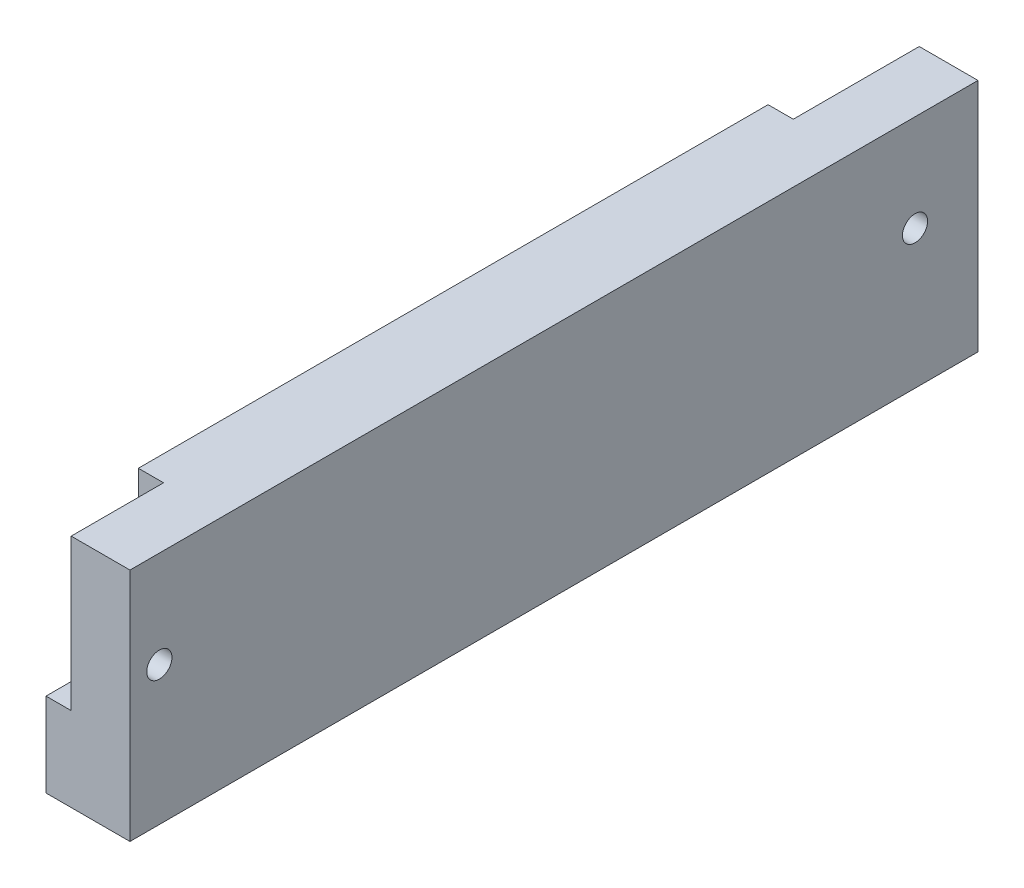
ISO-10303-21;
HEADER;
FILE_DESCRIPTION(('STEP AP214'),'2;1');
FILE_NAME('part.step','',(''),(''),'','','');
FILE_SCHEMA(('AUTOMOTIVE_DESIGN { 1 0 10303 214 1 1 1 1 }'));
ENDSEC;
DATA;
#1=APPLICATION_CONTEXT('core data for automotive mechanical design processes');
#2=APPLICATION_PROTOCOL_DEFINITION('international standard','automotive_design',2000,#1);
#3=PRODUCT_CONTEXT('',#1,'mechanical');
#4=PRODUCT('Part','Part','',(#3));
#5=PRODUCT_RELATED_PRODUCT_CATEGORY('part','',(#4));
#6=PRODUCT_DEFINITION_FORMATION('','',#4);
#7=PRODUCT_DEFINITION_CONTEXT('part definition',#1,'design');
#8=PRODUCT_DEFINITION('design','',#6,#7);
#9=PRODUCT_DEFINITION_SHAPE('','',#8);
#10=(LENGTH_UNIT() NAMED_UNIT(*) SI_UNIT(.MILLI.,.METRE.));
#11=(NAMED_UNIT(*) PLANE_ANGLE_UNIT() SI_UNIT($,.RADIAN.));
#12=(NAMED_UNIT(*) SI_UNIT($,.STERADIAN.) SOLID_ANGLE_UNIT());
#13=UNCERTAINTY_MEASURE_WITH_UNIT(LENGTH_MEASURE(1.E-05),#10,'distance_accuracy_value','');
#14=(GEOMETRIC_REPRESENTATION_CONTEXT(3) GLOBAL_UNCERTAINTY_ASSIGNED_CONTEXT((#13)) GLOBAL_UNIT_ASSIGNED_CONTEXT((#10,
#11,#12)) REPRESENTATION_CONTEXT('',''));
#15=CARTESIAN_POINT('',(0.,0.,0.));
#16=DIRECTION('',(0.,0.,1.));
#17=DIRECTION('',(1.,0.,0.));
#18=AXIS2_PLACEMENT_3D('',#15,#16,#17);
#19=CARTESIAN_POINT('',(5.,14.,105.));
#20=DIRECTION('',(-1.,0.,0.));
#21=DIRECTION('',(0.,0.,1.));
#22=AXIS2_PLACEMENT_3D('',#19,#20,#21);
#23=PLANE('',#22);
#24=CARTESIAN_POINT('',(5.,2.49999999999999,97.5));
#25=DIRECTION('',(-1.,0.,0.));
#26=DIRECTION('',(0.,-1.,0.));
#27=AXIS2_PLACEMENT_3D('',#24,#25,#26);
#28=CIRCLE('',#27,1.5);
#29=CARTESIAN_POINT('',(5.,0.999999999999996,97.5));
#30=VERTEX_POINT('',#29);
#31=EDGE_CURVE('E146',#30,#30,#28,.T.);
#32=ORIENTED_EDGE('',*,*,#31,.T.);
#33=EDGE_LOOP('',(#32));
#34=FACE_BOUND('',#33,.T.);
#35=CARTESIAN_POINT('',(5.,2.49999999999999,7.5));
#36=DIRECTION('',(-1.,0.,0.));
#37=DIRECTION('',(0.,-1.,0.));
#38=AXIS2_PLACEMENT_3D('',#35,#36,#37);
#39=CIRCLE('',#38,1.5);
#40=CARTESIAN_POINT('',(5.,0.999999999999995,7.5));
#41=VERTEX_POINT('',#40);
#42=EDGE_CURVE('E142',#41,#41,#39,.T.);
#43=ORIENTED_EDGE('',*,*,#42,.T.);
#44=EDGE_LOOP('',(#43));
#45=FACE_BOUND('',#44,.T.);
#46=DIRECTION('',(0.,1.,0.));
#47=VECTOR('',#46,1.);
#48=CARTESIAN_POINT('',(5.,14.,101.));
#49=LINE('',#48,#47);
#50=CARTESIAN_POINT('',(5.,-14.,101.));
#51=VERTEX_POINT('',#50);
#52=CARTESIAN_POINT('',(5.,14.,101.));
#53=VERTEX_POINT('',#52);
#54=EDGE_CURVE('E232',#51,#53,#49,.T.);
#55=ORIENTED_EDGE('',*,*,#54,.F.);
#56=DIRECTION('',(0.,0.,-1.));
#57=VECTOR('',#56,1.);
#58=CARTESIAN_POINT('',(5.,-14.,105.));
#59=LINE('',#58,#57);
#60=CARTESIAN_POINT('',(5.,-14.,0.));
#61=VERTEX_POINT('',#60);
#62=EDGE_CURVE('E172',#51,#61,#59,.T.);
#63=ORIENTED_EDGE('',*,*,#62,.T.);
#64=DIRECTION('',(0.,1.,0.));
#65=VECTOR('',#64,1.);
#66=CARTESIAN_POINT('',(5.,14.,0.));
#67=LINE('',#66,#65);
#68=CARTESIAN_POINT('',(5.,14.,0.));
#69=VERTEX_POINT('',#68);
#70=EDGE_CURVE('E153',#61,#69,#67,.T.);
#71=ORIENTED_EDGE('',*,*,#70,.T.);
#72=DIRECTION('',(0.,0.,-1.));
#73=VECTOR('',#72,1.);
#74=CARTESIAN_POINT('',(5.,14.,105.));
#75=LINE('',#74,#73);
#76=EDGE_CURVE('E40',#53,#69,#75,.T.);
#77=ORIENTED_EDGE('',*,*,#76,.F.);
#78=EDGE_LOOP('',(#55,#63,#71,#77));
#79=FACE_BOUND('',#78,.T.);
#80=ADVANCED_FACE('F33',(#34,#45,#79),#23,.F.);
#81=CARTESIAN_POINT('',(-5.,14.,105.));
#82=DIRECTION('',(0.,-1.,0.));
#83=DIRECTION('',(0.,0.,-1.));
#84=AXIS2_PLACEMENT_3D('',#81,#82,#83);
#85=PLANE('',#84);
#86=DIRECTION('',(-1.,0.,0.));
#87=VECTOR('',#86,1.);
#88=CARTESIAN_POINT('',(-5.,14.,101.));
#89=LINE('',#88,#87);
#90=CARTESIAN_POINT('',(-2.,14.,101.));
#91=VERTEX_POINT('',#90);
#92=EDGE_CURVE('E123',#53,#91,#89,.T.);
#93=ORIENTED_EDGE('',*,*,#92,.F.);
#94=ORIENTED_EDGE('',*,*,#76,.T.);
#95=DIRECTION('',(-1.,0.,0.));
#96=VECTOR('',#95,1.);
#97=CARTESIAN_POINT('',(-5.,14.,0.));
#98=LINE('',#97,#96);
#99=CARTESIAN_POINT('',(-2.,14.,0.));
#100=VERTEX_POINT('',#99);
#101=EDGE_CURVE('E164',#69,#100,#98,.T.);
#102=ORIENTED_EDGE('',*,*,#101,.T.);
#103=DIRECTION('',(0.,0.,-1.));
#104=VECTOR('',#103,1.);
#105=CARTESIAN_POINT('',(-2.,14.,0.));
#106=LINE('',#105,#104);
#107=CARTESIAN_POINT('',(-2.,14.,15.));
#108=VERTEX_POINT('',#107);
#109=EDGE_CURVE('E54',#108,#100,#106,.T.);
#110=ORIENTED_EDGE('',*,*,#109,.F.);
#111=DIRECTION('',(-1.,0.,0.));
#112=VECTOR('',#111,1.);
#113=CARTESIAN_POINT('',(-2.,14.,15.));
#114=LINE('',#113,#112);
#115=CARTESIAN_POINT('',(-5.,14.,15.));
#116=VERTEX_POINT('',#115);
#117=EDGE_CURVE('E181',#108,#116,#114,.T.);
#118=ORIENTED_EDGE('',*,*,#117,.T.);
#119=DIRECTION('',(0.,0.,-1.));
#120=VECTOR('',#119,1.);
#121=CARTESIAN_POINT('',(-5.,14.,105.));
#122=LINE('',#121,#120);
#123=CARTESIAN_POINT('',(-5.,14.,90.));
#124=VERTEX_POINT('',#123);
#125=EDGE_CURVE('E175',#124,#116,#122,.T.);
#126=ORIENTED_EDGE('',*,*,#125,.F.);
#127=DIRECTION('',(-1.,0.,0.));
#128=VECTOR('',#127,1.);
#129=CARTESIAN_POINT('',(-2.,14.,90.));
#130=LINE('',#129,#128);
#131=CARTESIAN_POINT('',(-2.,14.,90.));
#132=VERTEX_POINT('',#131);
#133=EDGE_CURVE('E139',#132,#124,#130,.T.);
#134=ORIENTED_EDGE('',*,*,#133,.F.);
#135=DIRECTION('',(0.,0.,-1.));
#136=VECTOR('',#135,1.);
#137=CARTESIAN_POINT('',(-2.,14.,105.));
#138=LINE('',#137,#136);
#139=EDGE_CURVE('E128',#91,#132,#138,.T.);
#140=ORIENTED_EDGE('',*,*,#139,.F.);
#141=EDGE_LOOP('',(#93,#94,#102,#110,#118,#126,#134,#140));
#142=FACE_BOUND('',#141,.T.);
#143=ADVANCED_FACE('F200',(#142),#85,.F.);
#144=CARTESIAN_POINT('',(-5.,14.,105.));
#145=DIRECTION('',(1.,0.,0.));
#146=DIRECTION('',(0.,1.,0.));
#147=AXIS2_PLACEMENT_3D('',#144,#145,#146);
#148=PLANE('',#147);
#149=DIRECTION('',(0.,-1.,0.));
#150=VECTOR('',#149,1.);
#151=CARTESIAN_POINT('',(-5.,14.,101.));
#152=LINE('',#151,#150);
#153=CARTESIAN_POINT('',(-5.,-4.,101.));
#154=VERTEX_POINT('',#153);
#155=CARTESIAN_POINT('',(-5.,-14.,101.));
#156=VERTEX_POINT('',#155);
#157=EDGE_CURVE('E109',#154,#156,#152,.T.);
#158=ORIENTED_EDGE('',*,*,#157,.F.);
#159=DIRECTION('',(0.,0.,1.));
#160=VECTOR('',#159,1.);
#161=CARTESIAN_POINT('',(-5.,-4.,105.));
#162=LINE('',#161,#160);
#163=CARTESIAN_POINT('',(-5.,-4.00000000000001,90.));
#164=VERTEX_POINT('',#163);
#165=EDGE_CURVE('E120',#164,#154,#162,.T.);
#166=ORIENTED_EDGE('',*,*,#165,.F.);
#167=DIRECTION('',(0.,-1.,0.));
#168=VECTOR('',#167,1.);
#169=CARTESIAN_POINT('',(-5.,14.,90.));
#170=LINE('',#169,#168);
#171=EDGE_CURVE('E129',#124,#164,#170,.T.);
#172=ORIENTED_EDGE('',*,*,#171,.F.);
#173=ORIENTED_EDGE('',*,*,#125,.T.);
#174=DIRECTION('',(0.,1.,0.));
#175=VECTOR('',#174,1.);
#176=CARTESIAN_POINT('',(-5.,14.,15.));
#177=LINE('',#176,#175);
#178=CARTESIAN_POINT('',(-5.,-4.,15.));
#179=VERTEX_POINT('',#178);
#180=EDGE_CURVE('E208',#179,#116,#177,.T.);
#181=ORIENTED_EDGE('',*,*,#180,.F.);
#182=DIRECTION('',(0.,0.,1.));
#183=VECTOR('',#182,1.);
#184=CARTESIAN_POINT('',(-5.,-4.,0.));
#185=LINE('',#184,#183);
#186=CARTESIAN_POINT('',(-5.,-4.,0.));
#187=VERTEX_POINT('',#186);
#188=EDGE_CURVE('E138',#187,#179,#185,.T.);
#189=ORIENTED_EDGE('',*,*,#188,.F.);
#190=DIRECTION('',(0.,-1.,0.));
#191=VECTOR('',#190,1.);
#192=CARTESIAN_POINT('',(-5.,14.,0.));
#193=LINE('',#192,#191);
#194=CARTESIAN_POINT('',(-5.,-14.,0.));
#195=VERTEX_POINT('',#194);
#196=EDGE_CURVE('E167',#187,#195,#193,.T.);
#197=ORIENTED_EDGE('',*,*,#196,.T.);
#198=DIRECTION('',(0.,0.,-1.));
#199=VECTOR('',#198,1.);
#200=CARTESIAN_POINT('',(-5.,-14.,105.));
#201=LINE('',#200,#199);
#202=EDGE_CURVE('E122',#156,#195,#201,.T.);
#203=ORIENTED_EDGE('',*,*,#202,.F.);
#204=EDGE_LOOP('',(#158,#166,#172,#173,#181,#189,#197,#203));
#205=FACE_BOUND('',#204,.T.);
#206=ADVANCED_FACE('F118',(#205),#148,.F.);
#207=CARTESIAN_POINT('',(-5.,-14.,105.));
#208=DIRECTION('',(0.,1.,0.));
#209=DIRECTION('',(0.,0.,1.));
#210=AXIS2_PLACEMENT_3D('',#207,#208,#209);
#211=PLANE('',#210);
#212=CARTESIAN_POINT('',(0.,-14.,7.5));
#213=DIRECTION('',(0.,-1.,0.));
#214=DIRECTION('',(0.,0.,-1.));
#215=AXIS2_PLACEMENT_3D('',#212,#213,#214);
#216=CIRCLE('',#215,1.5);
#217=CARTESIAN_POINT('',(0.,-14.,6.));
#218=VERTEX_POINT('',#217);
#219=EDGE_CURVE('E145',#218,#218,#216,.T.);
#220=ORIENTED_EDGE('',*,*,#219,.F.);
#221=EDGE_LOOP('',(#220));
#222=FACE_BOUND('',#221,.T.);
#223=CARTESIAN_POINT('',(0.,-14.,97.5));
#224=DIRECTION('',(0.,-1.,0.));
#225=DIRECTION('',(0.,0.,-1.));
#226=AXIS2_PLACEMENT_3D('',#223,#224,#225);
#227=CIRCLE('',#226,1.5);
#228=CARTESIAN_POINT('',(0.,-14.,96.));
#229=VERTEX_POINT('',#228);
#230=EDGE_CURVE('E154',#229,#229,#227,.T.);
#231=ORIENTED_EDGE('',*,*,#230,.F.);
#232=EDGE_LOOP('',(#231));
#233=FACE_BOUND('',#232,.T.);
#234=DIRECTION('',(1.,0.,0.));
#235=VECTOR('',#234,1.);
#236=CARTESIAN_POINT('',(-5.,-14.,101.));
#237=LINE('',#236,#235);
#238=EDGE_CURVE('E133',#156,#51,#237,.T.);
#239=ORIENTED_EDGE('',*,*,#238,.F.);
#240=ORIENTED_EDGE('',*,*,#202,.T.);
#241=DIRECTION('',(1.,0.,0.));
#242=VECTOR('',#241,1.);
#243=CARTESIAN_POINT('',(-5.,-14.,0.));
#244=LINE('',#243,#242);
#245=EDGE_CURVE('E169',#195,#61,#244,.T.);
#246=ORIENTED_EDGE('',*,*,#245,.T.);
#247=ORIENTED_EDGE('',*,*,#62,.F.);
#248=EDGE_LOOP('',(#239,#240,#246,#247));
#249=FACE_BOUND('',#248,.T.);
#250=ADVANCED_FACE('F191',(#222,#233,#249),#211,.F.);
#251=CARTESIAN_POINT('',(-2.,0.,0.));
#252=DIRECTION('',(1.,0.,0.));
#253=DIRECTION('',(0.,1.,0.));
#254=AXIS2_PLACEMENT_3D('',#251,#252,#253);
#255=PLANE('',#254);
#256=CARTESIAN_POINT('',(-2.,2.49999999999999,97.5));
#257=DIRECTION('',(1.,0.,0.));
#258=DIRECTION('',(0.,1.,0.));
#259=AXIS2_PLACEMENT_3D('',#256,#257,#258);
#260=CIRCLE('',#259,1.5);
#261=CARTESIAN_POINT('',(-2.,0.999999999999997,97.5));
#262=VERTEX_POINT('',#261);
#263=EDGE_CURVE('E149',#262,#262,#260,.F.);
#264=ORIENTED_EDGE('',*,*,#263,.F.);
#265=EDGE_LOOP('',(#264));
#266=FACE_BOUND('',#265,.T.);
#267=DIRECTION('',(0.,-1.,0.));
#268=VECTOR('',#267,1.);
#269=CARTESIAN_POINT('',(-2.,0.,101.));
#270=LINE('',#269,#268);
#271=CARTESIAN_POINT('',(-2.,-4.,101.));
#272=VERTEX_POINT('',#271);
#273=EDGE_CURVE('E46',#91,#272,#270,.T.);
#274=ORIENTED_EDGE('',*,*,#273,.F.);
#275=ORIENTED_EDGE('',*,*,#139,.T.);
#276=DIRECTION('',(0.,-1.,0.));
#277=VECTOR('',#276,1.);
#278=CARTESIAN_POINT('',(-2.,14.,90.));
#279=LINE('',#278,#277);
#280=CARTESIAN_POINT('',(-2.,-4.00000000000001,90.));
#281=VERTEX_POINT('',#280);
#282=EDGE_CURVE('E131',#132,#281,#279,.T.);
#283=ORIENTED_EDGE('',*,*,#282,.T.);
#284=DIRECTION('',(0.,0.,1.));
#285=VECTOR('',#284,1.);
#286=CARTESIAN_POINT('',(-2.,-4.,105.));
#287=LINE('',#286,#285);
#288=EDGE_CURVE('E141',#281,#272,#287,.T.);
#289=ORIENTED_EDGE('',*,*,#288,.T.);
#290=EDGE_LOOP('',(#274,#275,#283,#289));
#291=FACE_BOUND('',#290,.T.);
#292=ADVANCED_FACE('F188',(#266,#291),#255,.F.);
#293=CARTESIAN_POINT('',(-2.,-4.,105.));
#294=DIRECTION('',(0.,-1.,0.));
#295=DIRECTION('',(0.,0.,-1.));
#296=AXIS2_PLACEMENT_3D('',#293,#294,#295);
#297=PLANE('',#296);
#298=DIRECTION('',(-1.,0.,0.));
#299=VECTOR('',#298,1.);
#300=CARTESIAN_POINT('',(-2.,-4.,101.));
#301=LINE('',#300,#299);
#302=EDGE_CURVE('E11',#272,#154,#301,.T.);
#303=ORIENTED_EDGE('',*,*,#302,.F.);
#304=ORIENTED_EDGE('',*,*,#288,.F.);
#305=DIRECTION('',(-1.,0.,0.));
#306=VECTOR('',#305,1.);
#307=CARTESIAN_POINT('',(-2.,-4.00000000000001,90.));
#308=LINE('',#307,#306);
#309=EDGE_CURVE('E126',#281,#164,#308,.T.);
#310=ORIENTED_EDGE('',*,*,#309,.T.);
#311=ORIENTED_EDGE('',*,*,#165,.T.);
#312=EDGE_LOOP('',(#303,#304,#310,#311));
#313=FACE_BOUND('',#312,.T.);
#314=ADVANCED_FACE('F125',(#313),#297,.F.);
#315=CARTESIAN_POINT('',(5.,2.49999999999999,7.5));
#316=DIRECTION('',(-1.,0.,0.));
#317=DIRECTION('',(0.,-1.,0.));
#318=AXIS2_PLACEMENT_3D('',#315,#316,#317);
#319=CYLINDRICAL_SURFACE('',#318,1.5);
#320=CARTESIAN_POINT('',(-2.,2.49999999999999,7.5));
#321=DIRECTION('',(-1.,0.,0.));
#322=DIRECTION('',(0.,-1.,0.));
#323=AXIS2_PLACEMENT_3D('',#320,#321,#322);
#324=CIRCLE('',#323,1.5);
#325=CARTESIAN_POINT('',(-2.,0.999999999999995,7.5));
#326=VERTEX_POINT('',#325);
#327=EDGE_CURVE('E179',#326,#326,#324,.F.);
#328=CARTESIAN_POINT('',(5.,0.999999999999995,7.5));
#329=CARTESIAN_POINT('',(4.92708333333334,0.999999999999995,7.5));
#330=CARTESIAN_POINT('',(4.85416666666667,0.999999999999995,7.5));
#331=CARTESIAN_POINT('',(4.70833333333333,0.999999999999995,7.5));
#332=CARTESIAN_POINT('',(4.63541666666667,0.999999999999995,7.5));
#333=CARTESIAN_POINT('',(4.48958333333333,0.999999999999995,7.5));
#334=CARTESIAN_POINT('',(4.41666666666667,0.999999999999995,7.5));
#335=CARTESIAN_POINT('',(4.27083333333333,0.999999999999995,7.5));
#336=CARTESIAN_POINT('',(4.19791666666667,0.999999999999995,7.5));
#337=CARTESIAN_POINT('',(4.05208333333333,0.999999999999995,7.5));
#338=CARTESIAN_POINT('',(3.97916666666667,0.999999999999995,7.5));
#339=CARTESIAN_POINT('',(3.83333333333333,0.999999999999995,7.5));
#340=CARTESIAN_POINT('',(3.76041666666667,0.999999999999995,7.5));
#341=CARTESIAN_POINT('',(3.61458333333333,0.999999999999995,7.5));
#342=CARTESIAN_POINT('',(3.54166666666667,0.999999999999995,7.5));
#343=CARTESIAN_POINT('',(3.39583333333333,0.999999999999995,7.5));
#344=CARTESIAN_POINT('',(3.32291666666667,0.999999999999995,7.5));
#345=CARTESIAN_POINT('',(3.17708333333333,0.999999999999995,7.5));
#346=CARTESIAN_POINT('',(3.10416666666667,0.999999999999995,7.5));
#347=CARTESIAN_POINT('',(2.95833333333333,0.999999999999995,7.5));
#348=CARTESIAN_POINT('',(2.88541666666667,0.999999999999995,7.5));
#349=CARTESIAN_POINT('',(2.73958333333333,0.999999999999995,7.5));
#350=CARTESIAN_POINT('',(2.66666666666667,0.999999999999995,7.5));
#351=CARTESIAN_POINT('',(2.52083333333333,0.999999999999995,7.5));
#352=CARTESIAN_POINT('',(2.44791666666667,0.999999999999995,7.5));
#353=CARTESIAN_POINT('',(2.30208333333333,0.999999999999995,7.5));
#354=CARTESIAN_POINT('',(2.22916666666667,0.999999999999995,7.5));
#355=CARTESIAN_POINT('',(2.08333333333333,0.999999999999995,7.5));
#356=CARTESIAN_POINT('',(2.01041666666667,0.999999999999995,7.5));
#357=CARTESIAN_POINT('',(1.86458333333333,0.999999999999995,7.5));
#358=CARTESIAN_POINT('',(1.79166666666667,0.999999999999995,7.5));
#359=CARTESIAN_POINT('',(1.64583333333333,0.999999999999995,7.5));
#360=CARTESIAN_POINT('',(1.57291666666667,0.999999999999995,7.5));
#361=CARTESIAN_POINT('',(1.42708333333333,0.999999999999995,7.5));
#362=CARTESIAN_POINT('',(1.35416666666667,0.999999999999995,7.5));
#363=CARTESIAN_POINT('',(1.20833333333333,0.999999999999995,7.5));
#364=CARTESIAN_POINT('',(1.13541666666667,0.999999999999995,7.5));
#365=CARTESIAN_POINT('',(0.989583333333333,0.999999999999995,7.5));
#366=CARTESIAN_POINT('',(0.916666666666667,0.999999999999995,7.5));
#367=CARTESIAN_POINT('',(0.770833333333333,0.999999999999995,7.5));
#368=CARTESIAN_POINT('',(0.697916666666666,0.999999999999995,7.5));
#369=CARTESIAN_POINT('',(0.552083333333333,0.999999999999995,7.5));
#370=CARTESIAN_POINT('',(0.479166666666666,0.999999999999995,7.5));
#371=CARTESIAN_POINT('',(0.333333333333333,0.999999999999995,7.5));
#372=CARTESIAN_POINT('',(0.260416666666666,0.999999999999995,7.5));
#373=CARTESIAN_POINT('',(0.114583333333333,0.999999999999995,7.5));
#374=CARTESIAN_POINT('',(0.0416666666666658,0.999999999999995,7.5));
#375=CARTESIAN_POINT('',(-0.104166666666667,0.999999999999995,7.5));
#376=CARTESIAN_POINT('',(-0.177083333333334,0.999999999999995,7.5));
#377=CARTESIAN_POINT('',(-0.322916666666667,0.999999999999995,7.5));
#378=CARTESIAN_POINT('',(-0.395833333333334,0.999999999999995,7.5));
#379=CARTESIAN_POINT('',(-0.541666666666667,0.999999999999995,7.5));
#380=CARTESIAN_POINT('',(-0.614583333333334,0.999999999999995,7.5));
#381=CARTESIAN_POINT('',(-0.760416666666667,0.999999999999995,7.5));
#382=CARTESIAN_POINT('',(-0.833333333333334,0.999999999999995,7.5));
#383=CARTESIAN_POINT('',(-0.979166666666668,0.999999999999995,7.5));
#384=CARTESIAN_POINT('',(-1.05208333333333,0.999999999999995,7.5));
#385=CARTESIAN_POINT('',(-1.19791666666667,0.999999999999995,7.5));
#386=CARTESIAN_POINT('',(-1.27083333333333,0.999999999999995,7.5));
#387=CARTESIAN_POINT('',(-1.41666666666667,0.999999999999995,7.5));
#388=CARTESIAN_POINT('',(-1.48958333333333,0.999999999999995,7.5));
#389=CARTESIAN_POINT('',(-1.63541666666667,0.999999999999995,7.5));
#390=CARTESIAN_POINT('',(-1.70833333333333,0.999999999999995,7.5));
#391=CARTESIAN_POINT('',(-1.85416666666667,0.999999999999995,7.5));
#392=CARTESIAN_POINT('',(-1.92708333333334,0.999999999999995,7.5));
#393=CARTESIAN_POINT('',(-2.,0.999999999999995,7.5));
#394=B_SPLINE_CURVE_WITH_KNOTS('',3,(#328,#329,#330,#331,#332,#333,#334,#335,#336,#337,#338,
#339,#340,#341,#342,#343,#344,#345,#346,#347,#348,#349,#350,#351,#352,#353,#354,#355,#356,#357,
#358,#359,#360,#361,#362,#363,#364,#365,#366,#367,#368,#369,#370,#371,#372,#373,#374,#375,#376,
#377,#378,#379,#380,#381,#382,#383,#384,#385,#386,#387,#388,#389,#390,#391,#392,#393),
.UNSPECIFIED.,.F.,.F.,(4,2,2,2,2,2,2,2,2,2,2,2,2,2,2,2,2,2,2,2,2,2,2,2,2,2,2,2,2,2,2,2,4),(0.,
0.21875,0.4375,0.656250000000001,0.875000000000001,1.09375,1.3125,1.53125,1.75,1.96875,2.1875,
2.40625,2.625,2.84375,3.0625,3.28125,3.5,3.71875,3.9375,4.15625,4.375,4.59375,4.8125,5.03125,
5.25,5.46875,5.6875,5.90625,6.125,6.34375,6.5625,6.78125,7.),.UNSPECIFIED.);
#395=EDGE_CURVE('BSEAM265',#41,#326,#394,.T.);
#396=ORIENTED_EDGE('',*,*,#42,.F.);
#397=ORIENTED_EDGE('',*,*,#327,.F.);
#398=ORIENTED_EDGE('',*,*,#395,.T.);
#399=ORIENTED_EDGE('',*,*,#395,.F.);
#400=EDGE_LOOP('',(#396,#398,#397,#399));
#401=FACE_BOUND('',#400,.T.);
#402=ADVANCED_FACE('F265',(#401),#319,.F.);
#403=CARTESIAN_POINT('',(0.,0.,0.));
#404=DIRECTION('',(0.,0.,1.));
#405=DIRECTION('',(1.,0.,0.));
#406=AXIS2_PLACEMENT_3D('',#403,#404,#405);
#407=PLANE('',#406);
#408=ORIENTED_EDGE('',*,*,#196,.F.);
#409=DIRECTION('',(-1.,0.,0.));
#410=VECTOR('',#409,1.);
#411=CARTESIAN_POINT('',(-2.,-4.,0.));
#412=LINE('',#411,#410);
#413=CARTESIAN_POINT('',(-2.,-4.,0.));
#414=VERTEX_POINT('',#413);
#415=EDGE_CURVE('E222',#414,#187,#412,.T.);
#416=ORIENTED_EDGE('',*,*,#415,.F.);
#417=DIRECTION('',(0.,-1.,0.));
#418=VECTOR('',#417,1.);
#419=CARTESIAN_POINT('',(-2.,14.,0.));
#420=LINE('',#419,#418);
#421=EDGE_CURVE('E212',#100,#414,#420,.T.);
#422=ORIENTED_EDGE('',*,*,#421,.F.);
#423=ORIENTED_EDGE('',*,*,#101,.F.);
#424=ORIENTED_EDGE('',*,*,#70,.F.);
#425=ORIENTED_EDGE('',*,*,#245,.F.);
#426=EDGE_LOOP('',(#408,#416,#422,#423,#424,#425));
#427=FACE_BOUND('',#426,.T.);
#428=ADVANCED_FACE('F242',(#427),#407,.F.);
#429=CARTESIAN_POINT('',(0.,-4.00000000000001,7.5));
#430=DIRECTION('',(0.,-1.,0.));
#431=DIRECTION('',(0.,0.,-1.));
#432=AXIS2_PLACEMENT_3D('',#429,#430,#431);
#433=CYLINDRICAL_SURFACE('',#432,1.5);
#434=CARTESIAN_POINT('',(0.,-4.00000000000001,7.5));
#435=DIRECTION('',(0.,-1.,0.));
#436=DIRECTION('',(0.,0.,-1.));
#437=AXIS2_PLACEMENT_3D('',#434,#435,#436);
#438=CIRCLE('',#437,1.5);
#439=CARTESIAN_POINT('',(0.,-4.00000000000001,6.));
#440=VERTEX_POINT('',#439);
#441=EDGE_CURVE('E157',#440,#440,#438,.T.);
#442=ORIENTED_EDGE('',*,*,#441,.F.);
#443=EDGE_LOOP('',(#442));
#444=FACE_BOUND('',#443,.T.);
#445=ORIENTED_EDGE('',*,*,#219,.T.);
#446=EDGE_LOOP('',(#445));
#447=FACE_BOUND('',#446,.T.);
#448=ADVANCED_FACE('F342',(#444,#447),#433,.F.);
#449=CARTESIAN_POINT('',(0.,-4.00000000000001,7.5));
#450=DIRECTION('',(0.,-1.,0.));
#451=DIRECTION('',(0.,0.,-1.));
#452=AXIS2_PLACEMENT_3D('',#449,#450,#451);
#453=PLANE('',#452);
#454=ORIENTED_EDGE('',*,*,#441,.T.);
#455=EDGE_LOOP('',(#454));
#456=FACE_BOUND('',#455,.T.);
#457=ADVANCED_FACE('F350',(#456),#453,.T.);
#458=CARTESIAN_POINT('',(0.,-4.00000000000001,97.5));
#459=DIRECTION('',(0.,-1.,0.));
#460=DIRECTION('',(0.,0.,-1.));
#461=AXIS2_PLACEMENT_3D('',#458,#459,#460);
#462=CYLINDRICAL_SURFACE('',#461,1.5);
#463=CARTESIAN_POINT('',(0.,-4.00000000000001,97.5));
#464=DIRECTION('',(0.,-1.,0.));
#465=DIRECTION('',(0.,0.,-1.));
#466=AXIS2_PLACEMENT_3D('',#463,#464,#465);
#467=CIRCLE('',#466,1.5);
#468=CARTESIAN_POINT('',(0.,-4.00000000000001,96.));
#469=VERTEX_POINT('',#468);
#470=EDGE_CURVE('E150',#469,#469,#467,.T.);
#471=ORIENTED_EDGE('',*,*,#470,.F.);
#472=EDGE_LOOP('',(#471));
#473=FACE_BOUND('',#472,.T.);
#474=ORIENTED_EDGE('',*,*,#230,.T.);
#475=EDGE_LOOP('',(#474));
#476=FACE_BOUND('',#475,.T.);
#477=ADVANCED_FACE('F358',(#473,#476),#462,.F.);
#478=CARTESIAN_POINT('',(0.,-4.00000000000001,97.5));
#479=DIRECTION('',(0.,-1.,0.));
#480=DIRECTION('',(0.,0.,-1.));
#481=AXIS2_PLACEMENT_3D('',#478,#479,#480);
#482=PLANE('',#481);
#483=ORIENTED_EDGE('',*,*,#470,.T.);
#484=EDGE_LOOP('',(#483));
#485=FACE_BOUND('',#484,.T.);
#486=ADVANCED_FACE('F275',(#485),#482,.T.);
#487=CARTESIAN_POINT('',(5.,2.49999999999999,97.5));
#488=DIRECTION('',(-1.,0.,0.));
#489=DIRECTION('',(0.,-1.,0.));
#490=AXIS2_PLACEMENT_3D('',#487,#488,#489);
#491=CYLINDRICAL_SURFACE('',#490,1.5);
#492=CARTESIAN_POINT('',(-2.,0.999999999999997,97.5));
#493=CARTESIAN_POINT('',(-1.92708333333334,0.999999999999997,97.5));
#494=CARTESIAN_POINT('',(-1.85416666666667,0.999999999999997,97.5));
#495=CARTESIAN_POINT('',(-1.70833333333333,0.999999999999997,97.5));
#496=CARTESIAN_POINT('',(-1.63541666666667,0.999999999999997,97.5));
#497=CARTESIAN_POINT('',(-1.48958333333333,0.999999999999997,97.5));
#498=CARTESIAN_POINT('',(-1.41666666666667,0.999999999999997,97.5));
#499=CARTESIAN_POINT('',(-1.27083333333333,0.999999999999997,97.5));
#500=CARTESIAN_POINT('',(-1.19791666666667,0.999999999999997,97.5));
#501=CARTESIAN_POINT('',(-1.05208333333333,0.999999999999997,97.5));
#502=CARTESIAN_POINT('',(-0.979166666666668,0.999999999999997,97.5));
#503=CARTESIAN_POINT('',(-0.833333333333334,0.999999999999997,97.5));
#504=CARTESIAN_POINT('',(-0.760416666666667,0.999999999999997,97.5));
#505=CARTESIAN_POINT('',(-0.614583333333334,0.999999999999997,97.5));
#506=CARTESIAN_POINT('',(-0.541666666666667,0.999999999999997,97.5));
#507=CARTESIAN_POINT('',(-0.395833333333334,0.999999999999997,97.5));
#508=CARTESIAN_POINT('',(-0.322916666666667,0.999999999999997,97.5));
#509=CARTESIAN_POINT('',(-0.177083333333334,0.999999999999997,97.5));
#510=CARTESIAN_POINT('',(-0.104166666666667,0.999999999999997,97.5));
#511=CARTESIAN_POINT('',(0.0416666666666667,0.999999999999997,97.5));
#512=CARTESIAN_POINT('',(0.114583333333333,0.999999999999997,97.5));
#513=CARTESIAN_POINT('',(0.260416666666667,0.999999999999997,97.5));
#514=CARTESIAN_POINT('',(0.333333333333334,0.999999999999997,97.5));
#515=CARTESIAN_POINT('',(0.479166666666667,0.999999999999997,97.5));
#516=CARTESIAN_POINT('',(0.552083333333333,0.999999999999997,97.5));
#517=CARTESIAN_POINT('',(0.697916666666666,0.999999999999997,97.5));
#518=CARTESIAN_POINT('',(0.770833333333333,0.999999999999997,97.5));
#519=CARTESIAN_POINT('',(0.916666666666667,0.999999999999997,97.5));
#520=CARTESIAN_POINT('',(0.989583333333333,0.999999999999997,97.5));
#521=CARTESIAN_POINT('',(1.13541666666667,0.999999999999997,97.5));
#522=CARTESIAN_POINT('',(1.20833333333333,0.999999999999997,97.5));
#523=CARTESIAN_POINT('',(1.35416666666667,0.999999999999997,97.5));
#524=CARTESIAN_POINT('',(1.42708333333333,0.999999999999997,97.5));
#525=CARTESIAN_POINT('',(1.57291666666667,0.999999999999997,97.5));
#526=CARTESIAN_POINT('',(1.64583333333333,0.999999999999997,97.5));
#527=CARTESIAN_POINT('',(1.79166666666667,0.999999999999997,97.5));
#528=CARTESIAN_POINT('',(1.86458333333333,0.999999999999997,97.5));
#529=CARTESIAN_POINT('',(2.01041666666667,0.999999999999997,97.5));
#530=CARTESIAN_POINT('',(2.08333333333333,0.999999999999997,97.5));
#531=CARTESIAN_POINT('',(2.22916666666667,0.999999999999997,97.5));
#532=CARTESIAN_POINT('',(2.30208333333333,0.999999999999997,97.5));
#533=CARTESIAN_POINT('',(2.44791666666667,0.999999999999997,97.5));
#534=CARTESIAN_POINT('',(2.52083333333333,0.999999999999997,97.5));
#535=CARTESIAN_POINT('',(2.66666666666667,0.999999999999997,97.5));
#536=CARTESIAN_POINT('',(2.73958333333333,0.999999999999997,97.5));
#537=CARTESIAN_POINT('',(2.88541666666667,0.999999999999997,97.5));
#538=CARTESIAN_POINT('',(2.95833333333333,0.999999999999997,97.5));
#539=CARTESIAN_POINT('',(3.10416666666667,0.999999999999997,97.5));
#540=CARTESIAN_POINT('',(3.17708333333333,0.999999999999997,97.5));
#541=CARTESIAN_POINT('',(3.32291666666667,0.999999999999997,97.5));
#542=CARTESIAN_POINT('',(3.39583333333333,0.999999999999996,97.5));
#543=CARTESIAN_POINT('',(3.54166666666667,0.999999999999996,97.5));
#544=CARTESIAN_POINT('',(3.61458333333333,0.999999999999996,97.5));
#545=CARTESIAN_POINT('',(3.76041666666667,0.999999999999996,97.5));
#546=CARTESIAN_POINT('',(3.83333333333333,0.999999999999996,97.5));
#547=CARTESIAN_POINT('',(3.97916666666667,0.999999999999996,97.5));
#548=CARTESIAN_POINT('',(4.05208333333333,0.999999999999996,97.5));
#549=CARTESIAN_POINT('',(4.19791666666667,0.999999999999996,97.5));
#550=CARTESIAN_POINT('',(4.27083333333333,0.999999999999996,97.5));
#551=CARTESIAN_POINT('',(4.41666666666667,0.999999999999996,97.5));
#552=CARTESIAN_POINT('',(4.48958333333333,0.999999999999996,97.5));
#553=CARTESIAN_POINT('',(4.63541666666667,0.999999999999996,97.5));
#554=CARTESIAN_POINT('',(4.70833333333333,0.999999999999996,97.5));
#555=CARTESIAN_POINT('',(4.85416666666667,0.999999999999996,97.5));
#556=CARTESIAN_POINT('',(4.92708333333334,0.999999999999996,97.5));
#557=CARTESIAN_POINT('',(5.,0.999999999999996,97.5));
#558=B_SPLINE_CURVE_WITH_KNOTS('',3,(#492,#493,#494,#495,#496,#497,#498,#499,#500,#501,#502,
#503,#504,#505,#506,#507,#508,#509,#510,#511,#512,#513,#514,#515,#516,#517,#518,#519,#520,#521,
#522,#523,#524,#525,#526,#527,#528,#529,#530,#531,#532,#533,#534,#535,#536,#537,#538,#539,#540,
#541,#542,#543,#544,#545,#546,#547,#548,#549,#550,#551,#552,#553,#554,#555,#556,#557),
.UNSPECIFIED.,.F.,.F.,(4,2,2,2,2,2,2,2,2,2,2,2,2,2,2,2,2,2,2,2,2,2,2,2,2,2,2,2,2,2,2,2,4),(0.,
0.21875,0.4375,0.656250000000001,0.875000000000001,1.09375,1.3125,1.53125,1.75,1.96875,2.1875,
2.40625,2.625,2.84375,3.0625,3.28125,3.5,3.71875,3.9375,4.15625,4.375,4.59375,4.8125,5.03125,
5.25,5.46875,5.6875,5.90625,6.125,6.34375,6.5625,6.78125,7.),.UNSPECIFIED.);
#559=EDGE_CURVE('BSEAM185',#262,#30,#558,.T.);
#560=ORIENTED_EDGE('',*,*,#263,.T.);
#561=ORIENTED_EDGE('',*,*,#31,.F.);
#562=ORIENTED_EDGE('',*,*,#559,.T.);
#563=ORIENTED_EDGE('',*,*,#559,.F.);
#564=EDGE_LOOP('',(#560,#562,#561,#563));
#565=FACE_BOUND('',#564,.T.);
#566=ADVANCED_FACE('F185',(#565),#491,.F.);
#567=CARTESIAN_POINT('',(-2.,0.,0.));
#568=DIRECTION('',(-1.,0.,0.));
#569=DIRECTION('',(0.,-1.,0.));
#570=AXIS2_PLACEMENT_3D('',#567,#568,#569);
#571=PLANE('',#570);
#572=ORIENTED_EDGE('',*,*,#421,.T.);
#573=DIRECTION('',(0.,0.,1.));
#574=VECTOR('',#573,1.);
#575=CARTESIAN_POINT('',(-2.,-4.,0.));
#576=LINE('',#575,#574);
#577=CARTESIAN_POINT('',(-2.,-4.,15.));
#578=VERTEX_POINT('',#577);
#579=EDGE_CURVE('E214',#414,#578,#576,.T.);
#580=ORIENTED_EDGE('',*,*,#579,.T.);
#581=DIRECTION('',(0.,1.,0.));
#582=VECTOR('',#581,1.);
#583=CARTESIAN_POINT('',(-2.,14.,15.));
#584=LINE('',#583,#582);
#585=EDGE_CURVE('E226',#578,#108,#584,.T.);
#586=ORIENTED_EDGE('',*,*,#585,.T.);
#587=ORIENTED_EDGE('',*,*,#109,.T.);
#588=EDGE_LOOP('',(#572,#580,#586,#587));
#589=FACE_BOUND('',#588,.T.);
#590=ORIENTED_EDGE('',*,*,#327,.T.);
#591=EDGE_LOOP('',(#590));
#592=FACE_BOUND('',#591,.T.);
#593=ADVANCED_FACE('F245',(#589,#592),#571,.T.);
#594=CARTESIAN_POINT('',(-2.,14.,15.));
#595=DIRECTION('',(0.,0.,1.));
#596=DIRECTION('',(0.,-1.,0.));
#597=AXIS2_PLACEMENT_3D('',#594,#595,#596);
#598=PLANE('',#597);
#599=ORIENTED_EDGE('',*,*,#180,.T.);
#600=ORIENTED_EDGE('',*,*,#117,.F.);
#601=ORIENTED_EDGE('',*,*,#585,.F.);
#602=DIRECTION('',(-1.,0.,0.));
#603=VECTOR('',#602,1.);
#604=CARTESIAN_POINT('',(-2.,-4.,15.));
#605=LINE('',#604,#603);
#606=EDGE_CURVE('E220',#578,#179,#605,.T.);
#607=ORIENTED_EDGE('',*,*,#606,.T.);
#608=EDGE_LOOP('',(#599,#600,#601,#607));
#609=FACE_BOUND('',#608,.T.);
#610=ADVANCED_FACE('F244',(#609),#598,.F.);
#611=CARTESIAN_POINT('',(-2.,-4.,0.));
#612=DIRECTION('',(0.,-1.,0.));
#613=DIRECTION('',(1.,0.,0.));
#614=AXIS2_PLACEMENT_3D('',#611,#612,#613);
#615=PLANE('',#614);
#616=ORIENTED_EDGE('',*,*,#188,.T.);
#617=ORIENTED_EDGE('',*,*,#606,.F.);
#618=ORIENTED_EDGE('',*,*,#579,.F.);
#619=ORIENTED_EDGE('',*,*,#415,.T.);
#620=EDGE_LOOP('',(#616,#617,#618,#619));
#621=FACE_BOUND('',#620,.T.);
#622=ADVANCED_FACE('F247',(#621),#615,.F.);
#623=CARTESIAN_POINT('',(-2.,14.,90.));
#624=DIRECTION('',(0.,0.,-1.));
#625=DIRECTION('',(-1.,0.,0.));
#626=AXIS2_PLACEMENT_3D('',#623,#624,#625);
#627=PLANE('',#626);
#628=ORIENTED_EDGE('',*,*,#171,.T.);
#629=ORIENTED_EDGE('',*,*,#309,.F.);
#630=ORIENTED_EDGE('',*,*,#282,.F.);
#631=ORIENTED_EDGE('',*,*,#133,.T.);
#632=EDGE_LOOP('',(#628,#629,#630,#631));
#633=FACE_BOUND('',#632,.T.);
#634=ADVANCED_FACE('F205',(#633),#627,.F.);
#635=CARTESIAN_POINT('',(0.,0.,101.));
#636=DIRECTION('',(0.,0.,1.));
#637=DIRECTION('',(1.,0.,0.));
#638=AXIS2_PLACEMENT_3D('',#635,#636,#637);
#639=PLANE('',#638);
#640=ORIENTED_EDGE('',*,*,#238,.T.);
#641=ORIENTED_EDGE('',*,*,#54,.T.);
#642=ORIENTED_EDGE('',*,*,#92,.T.);
#643=ORIENTED_EDGE('',*,*,#273,.T.);
#644=ORIENTED_EDGE('',*,*,#302,.T.);
#645=ORIENTED_EDGE('',*,*,#157,.T.);
#646=EDGE_LOOP('',(#640,#641,#642,#643,#644,#645));
#647=FACE_BOUND('',#646,.T.);
#648=ADVANCED_FACE('F108',(#647),#639,.T.);
#649=CLOSED_SHELL('',(#80,#143,#206,#250,#292,#314,#402,#428,#448,#457,#477,#486,#566,#593,#610,
#622,#634,#648));
#650=MANIFOLD_SOLID_BREP('B2',#649);
#651=ADVANCED_BREP_SHAPE_REPRESENTATION('',(#18,#650),#14);
#652=SHAPE_DEFINITION_REPRESENTATION(#9,#651);
ENDSEC;
END-ISO-10303-21;
